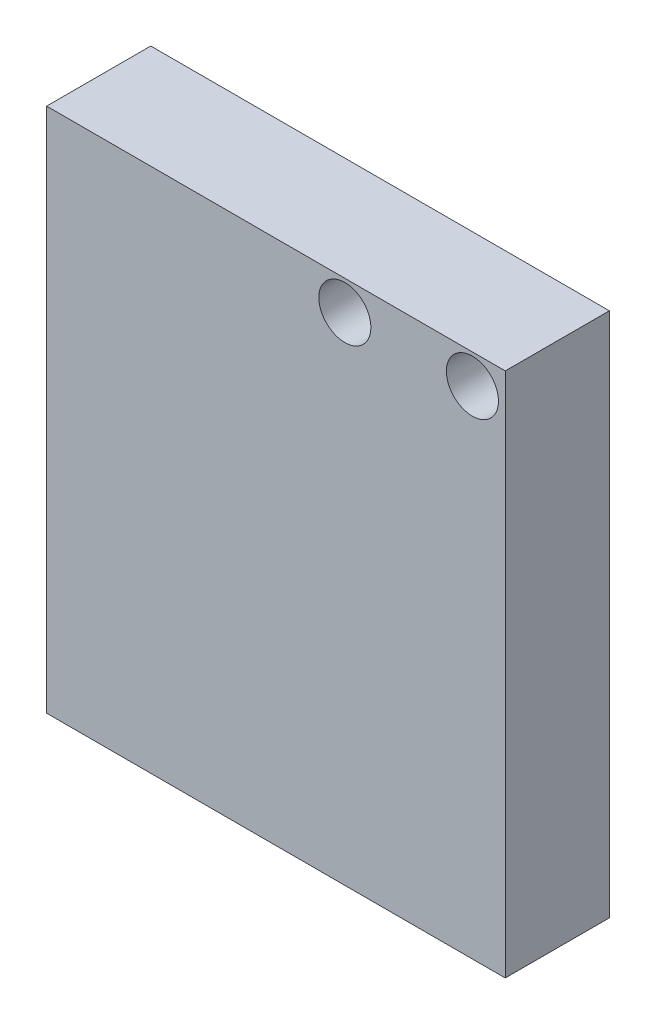
ISO-10303-21;
HEADER;
FILE_DESCRIPTION(('STEP AP214'),'2;1');
FILE_NAME('part.step','',(''),(''),'','','');
FILE_SCHEMA(('AUTOMOTIVE_DESIGN { 1 0 10303 214 1 1 1 1 }'));
ENDSEC;
DATA;
#1=APPLICATION_CONTEXT('core data for automotive mechanical design processes');
#2=APPLICATION_PROTOCOL_DEFINITION('international standard','automotive_design',2000,#1);
#3=PRODUCT_CONTEXT('',#1,'mechanical');
#4=PRODUCT('Part','Part','',(#3));
#5=PRODUCT_RELATED_PRODUCT_CATEGORY('part','',(#4));
#6=PRODUCT_DEFINITION_FORMATION('','',#4);
#7=PRODUCT_DEFINITION_CONTEXT('part definition',#1,'design');
#8=PRODUCT_DEFINITION('design','',#6,#7);
#9=PRODUCT_DEFINITION_SHAPE('','',#8);
#10=(LENGTH_UNIT() NAMED_UNIT(*) SI_UNIT(.MILLI.,.METRE.));
#11=(NAMED_UNIT(*) PLANE_ANGLE_UNIT() SI_UNIT($,.RADIAN.));
#12=(NAMED_UNIT(*) SI_UNIT($,.STERADIAN.) SOLID_ANGLE_UNIT());
#13=UNCERTAINTY_MEASURE_WITH_UNIT(LENGTH_MEASURE(1.E-05),#10,'distance_accuracy_value','');
#14=(GEOMETRIC_REPRESENTATION_CONTEXT(3) GLOBAL_UNCERTAINTY_ASSIGNED_CONTEXT((#13)) GLOBAL_UNIT_ASSIGNED_CONTEXT((#10,
#11,#12)) REPRESENTATION_CONTEXT('',''));
#15=CARTESIAN_POINT('',(0.,0.,0.));
#16=DIRECTION('',(0.,0.,1.));
#17=DIRECTION('',(1.,0.,0.));
#18=AXIS2_PLACEMENT_3D('',#15,#16,#17);
#19=CARTESIAN_POINT('',(0.,0.,10.));
#20=DIRECTION('',(0.,0.,-1.));
#21=DIRECTION('',(-1.,0.,0.));
#22=AXIS2_PLACEMENT_3D('',#19,#20,#21);
#23=PLANE('',#22);
#24=DIRECTION('',(1.,0.,0.));
#25=VECTOR('',#24,1.);
#26=CARTESIAN_POINT('',(4062.09199021312,-3176.11053212301,10.));
#27=LINE('',#26,#25);
#28=CARTESIAN_POINT('',(4062.09199021312,-3176.11053212301,10.));
#29=VERTEX_POINT('',#28);
#30=CARTESIAN_POINT('',(4079.7119738264,-3176.11053212301,10.));
#31=VERTEX_POINT('',#30);
#32=EDGE_CURVE('E126',#29,#31,#27,.T.);
#33=ORIENTED_EDGE('',*,*,#32,.F.);
#34=DIRECTION('',(0.,-1.,0.));
#35=VECTOR('',#34,1.);
#36=CARTESIAN_POINT('',(4062.09199021312,-3176.11053212301,10.));
#37=LINE('',#36,#35);
#38=CARTESIAN_POINT('',(4062.09199021312,-3196.3103157363,10.));
#39=VERTEX_POINT('',#38);
#40=EDGE_CURVE('E116',#29,#39,#37,.T.);
#41=ORIENTED_EDGE('',*,*,#40,.T.);
#42=DIRECTION('',(1.,0.,0.));
#43=VECTOR('',#42,1.);
#44=CARTESIAN_POINT('',(4062.09199021312,-3196.3103157363,10.));
#45=LINE('',#44,#43);
#46=CARTESIAN_POINT('',(4079.7119738264,-3196.3103157363,10.));
#47=VERTEX_POINT('',#46);
#48=EDGE_CURVE('E111',#39,#47,#45,.T.);
#49=ORIENTED_EDGE('',*,*,#48,.T.);
#50=DIRECTION('',(0.,-1.,0.));
#51=VECTOR('',#50,1.);
#52=CARTESIAN_POINT('',(4079.7119738264,-3176.11053212301,10.));
#53=LINE('',#52,#51);
#54=EDGE_CURVE('E115',#31,#47,#53,.T.);
#55=ORIENTED_EDGE('',*,*,#54,.F.);
#56=EDGE_LOOP('',(#33,#41,#49,#55));
#57=FACE_BOUND('',#56,.T.);
#58=CARTESIAN_POINT('',(4073.54903295597,-3177.24907009192,10.));
#59=DIRECTION('',(0.,0.,1.));
#60=DIRECTION('',(1.,0.,0.));
#61=AXIS2_PLACEMENT_3D('',#58,#59,#60);
#62=CIRCLE('',#61,1.00000000000012);
#63=CARTESIAN_POINT('',(4074.54903295597,-3177.24907009192,10.));
#64=VERTEX_POINT('',#63);
#65=EDGE_CURVE('E136',#64,#64,#62,.T.);
#66=ORIENTED_EDGE('',*,*,#65,.F.);
#67=EDGE_LOOP('',(#66));
#68=FACE_BOUND('',#67,.T.);
#69=CARTESIAN_POINT('',(4078.44986812273,-3177.24907009192,10.));
#70=DIRECTION('',(0.,0.,1.));
#71=DIRECTION('',(1.,0.,0.));
#72=AXIS2_PLACEMENT_3D('',#69,#70,#71);
#73=CIRCLE('',#72,1.00000000000012);
#74=CARTESIAN_POINT('',(4079.44986812273,-3177.24907009192,10.));
#75=VERTEX_POINT('',#74);
#76=EDGE_CURVE('E177',#75,#75,#73,.T.);
#77=ORIENTED_EDGE('',*,*,#76,.F.);
#78=EDGE_LOOP('',(#77));
#79=FACE_BOUND('',#78,.T.);
#80=ADVANCED_FACE('F65',(#57,#68,#79),#23,.F.);
#81=CARTESIAN_POINT('',(0.,0.,6.));
#82=DIRECTION('',(0.,0.,-1.));
#83=DIRECTION('',(-1.,0.,0.));
#84=AXIS2_PLACEMENT_3D('',#81,#82,#83);
#85=PLANE('',#84);
#86=CARTESIAN_POINT('',(4073.54903295597,-3177.24907009192,6.));
#87=DIRECTION('',(0.,0.,1.));
#88=DIRECTION('',(1.,0.,0.));
#89=AXIS2_PLACEMENT_3D('',#86,#87,#88);
#90=CIRCLE('',#89,1.00000000000012);
#91=CARTESIAN_POINT('',(4074.54903295597,-3177.24907009192,6.));
#92=VERTEX_POINT('',#91);
#93=EDGE_CURVE('E176',#92,#92,#90,.T.);
#94=ORIENTED_EDGE('',*,*,#93,.T.);
#95=EDGE_LOOP('',(#94));
#96=FACE_BOUND('',#95,.T.);
#97=DIRECTION('',(1.,0.,0.));
#98=VECTOR('',#97,1.);
#99=CARTESIAN_POINT('',(4062.09199021312,-3176.11053212301,6.));
#100=LINE('',#99,#98);
#101=CARTESIAN_POINT('',(4062.09199021312,-3176.11053212301,6.));
#102=VERTEX_POINT('',#101);
#103=CARTESIAN_POINT('',(4079.7119738264,-3176.11053212301,6.));
#104=VERTEX_POINT('',#103);
#105=EDGE_CURVE('E132',#102,#104,#100,.T.);
#106=ORIENTED_EDGE('',*,*,#105,.T.);
#107=DIRECTION('',(0.,-1.,0.));
#108=VECTOR('',#107,1.);
#109=CARTESIAN_POINT('',(4079.7119738264,-3176.11053212301,6.));
#110=LINE('',#109,#108);
#111=CARTESIAN_POINT('',(4079.7119738264,-3196.3103157363,6.));
#112=VERTEX_POINT('',#111);
#113=EDGE_CURVE('E135',#104,#112,#110,.T.);
#114=ORIENTED_EDGE('',*,*,#113,.T.);
#115=DIRECTION('',(1.,0.,0.));
#116=VECTOR('',#115,1.);
#117=CARTESIAN_POINT('',(4062.09199021312,-3196.3103157363,6.));
#118=LINE('',#117,#116);
#119=CARTESIAN_POINT('',(4062.09199021312,-3196.3103157363,6.));
#120=VERTEX_POINT('',#119);
#121=EDGE_CURVE('E123',#120,#112,#118,.T.);
#122=ORIENTED_EDGE('',*,*,#121,.F.);
#123=DIRECTION('',(0.,-1.,0.));
#124=VECTOR('',#123,1.);
#125=CARTESIAN_POINT('',(4062.09199021312,-3176.11053212301,6.));
#126=LINE('',#125,#124);
#127=EDGE_CURVE('E99',#102,#120,#126,.T.);
#128=ORIENTED_EDGE('',*,*,#127,.F.);
#129=EDGE_LOOP('',(#106,#114,#122,#128));
#130=FACE_BOUND('',#129,.T.);
#131=CARTESIAN_POINT('',(4078.44986812273,-3177.24907009192,6.));
#132=DIRECTION('',(0.,0.,1.));
#133=DIRECTION('',(1.,0.,0.));
#134=AXIS2_PLACEMENT_3D('',#131,#132,#133);
#135=CIRCLE('',#134,1.00000000000012);
#136=CARTESIAN_POINT('',(4079.44986812273,-3177.24907009192,6.));
#137=VERTEX_POINT('',#136);
#138=EDGE_CURVE('E180',#137,#137,#135,.T.);
#139=ORIENTED_EDGE('',*,*,#138,.T.);
#140=EDGE_LOOP('',(#139));
#141=FACE_BOUND('',#140,.T.);
#142=ADVANCED_FACE('F141',(#96,#130,#141),#85,.T.);
#143=CARTESIAN_POINT('',(4062.09199021312,-3176.11053212301,10.));
#144=DIRECTION('',(0.,1.,0.));
#145=DIRECTION('',(0.,0.,1.));
#146=AXIS2_PLACEMENT_3D('',#143,#144,#145);
#147=PLANE('',#146);
#148=ORIENTED_EDGE('',*,*,#105,.F.);
#149=DIRECTION('',(0.,0.,-1.));
#150=VECTOR('',#149,1.);
#151=CARTESIAN_POINT('',(4062.09199021312,-3176.11053212301,10.));
#152=LINE('',#151,#150);
#153=EDGE_CURVE('E12',#29,#102,#152,.T.);
#154=ORIENTED_EDGE('',*,*,#153,.F.);
#155=ORIENTED_EDGE('',*,*,#32,.T.);
#156=DIRECTION('',(0.,0.,-1.));
#157=VECTOR('',#156,1.);
#158=CARTESIAN_POINT('',(4079.7119738264,-3176.11053212301,10.));
#159=LINE('',#158,#157);
#160=EDGE_CURVE('E69',#31,#104,#159,.T.);
#161=ORIENTED_EDGE('',*,*,#160,.T.);
#162=EDGE_LOOP('',(#148,#154,#155,#161));
#163=FACE_BOUND('',#162,.T.);
#164=ADVANCED_FACE('F67',(#163),#147,.T.);
#165=CARTESIAN_POINT('',(4062.09199021312,-3176.11053212301,10.));
#166=DIRECTION('',(1.,0.,0.));
#167=DIRECTION('',(0.,0.,-1.));
#168=AXIS2_PLACEMENT_3D('',#165,#166,#167);
#169=PLANE('',#168);
#170=ORIENTED_EDGE('',*,*,#127,.T.);
#171=DIRECTION('',(0.,0.,-1.));
#172=VECTOR('',#171,1.);
#173=CARTESIAN_POINT('',(4062.09199021312,-3196.3103157363,10.));
#174=LINE('',#173,#172);
#175=EDGE_CURVE('E75',#39,#120,#174,.T.);
#176=ORIENTED_EDGE('',*,*,#175,.F.);
#177=ORIENTED_EDGE('',*,*,#40,.F.);
#178=ORIENTED_EDGE('',*,*,#153,.T.);
#179=EDGE_LOOP('',(#170,#176,#177,#178));
#180=FACE_BOUND('',#179,.T.);
#181=ADVANCED_FACE('F144',(#180),#169,.F.);
#182=CARTESIAN_POINT('',(4062.09199021312,-3196.3103157363,10.));
#183=DIRECTION('',(0.,1.,0.));
#184=DIRECTION('',(0.,0.,1.));
#185=AXIS2_PLACEMENT_3D('',#182,#183,#184);
#186=PLANE('',#185);
#187=ORIENTED_EDGE('',*,*,#121,.T.);
#188=DIRECTION('',(0.,0.,-1.));
#189=VECTOR('',#188,1.);
#190=CARTESIAN_POINT('',(4079.7119738264,-3196.3103157363,10.));
#191=LINE('',#190,#189);
#192=EDGE_CURVE('E120',#47,#112,#191,.T.);
#193=ORIENTED_EDGE('',*,*,#192,.F.);
#194=ORIENTED_EDGE('',*,*,#48,.F.);
#195=ORIENTED_EDGE('',*,*,#175,.T.);
#196=EDGE_LOOP('',(#187,#193,#194,#195));
#197=FACE_BOUND('',#196,.T.);
#198=ADVANCED_FACE('F121',(#197),#186,.F.);
#199=CARTESIAN_POINT('',(4079.7119738264,-3176.11053212301,10.));
#200=DIRECTION('',(1.,0.,0.));
#201=DIRECTION('',(0.,0.,-1.));
#202=AXIS2_PLACEMENT_3D('',#199,#200,#201);
#203=PLANE('',#202);
#204=ORIENTED_EDGE('',*,*,#113,.F.);
#205=ORIENTED_EDGE('',*,*,#160,.F.);
#206=ORIENTED_EDGE('',*,*,#54,.T.);
#207=ORIENTED_EDGE('',*,*,#192,.T.);
#208=EDGE_LOOP('',(#204,#205,#206,#207));
#209=FACE_BOUND('',#208,.T.);
#210=ADVANCED_FACE('F125',(#209),#203,.T.);
#211=CARTESIAN_POINT('',(4073.54903295597,-3177.24907009192,10.));
#212=DIRECTION('',(0.,0.,-1.));
#213=DIRECTION('',(-1.,0.,0.));
#214=AXIS2_PLACEMENT_3D('',#211,#212,#213);
#215=CYLINDRICAL_SURFACE('',#214,1.00000000000012);
#216=ORIENTED_EDGE('',*,*,#65,.T.);
#217=EDGE_LOOP('',(#216));
#218=FACE_BOUND('',#217,.T.);
#219=ORIENTED_EDGE('',*,*,#93,.F.);
#220=EDGE_LOOP('',(#219));
#221=FACE_BOUND('',#220,.T.);
#222=ADVANCED_FACE('F157',(#218,#221),#215,.F.);
#223=CARTESIAN_POINT('',(4078.44986812273,-3177.24907009192,10.));
#224=DIRECTION('',(0.,0.,-1.));
#225=DIRECTION('',(-1.,0.,0.));
#226=AXIS2_PLACEMENT_3D('',#223,#224,#225);
#227=CYLINDRICAL_SURFACE('',#226,1.00000000000012);
#228=ORIENTED_EDGE('',*,*,#76,.T.);
#229=EDGE_LOOP('',(#228));
#230=FACE_BOUND('',#229,.T.);
#231=ORIENTED_EDGE('',*,*,#138,.F.);
#232=EDGE_LOOP('',(#231));
#233=FACE_BOUND('',#232,.T.);
#234=ADVANCED_FACE('F165',(#230,#233),#227,.F.);
#235=CLOSED_SHELL('',(#80,#142,#164,#181,#198,#210,#222,#234));
#236=MANIFOLD_SOLID_BREP('B2',#235);
#237=ADVANCED_BREP_SHAPE_REPRESENTATION('',(#18,#236),#14);
#238=SHAPE_DEFINITION_REPRESENTATION(#9,#237);
ENDSEC;
END-ISO-10303-21;
